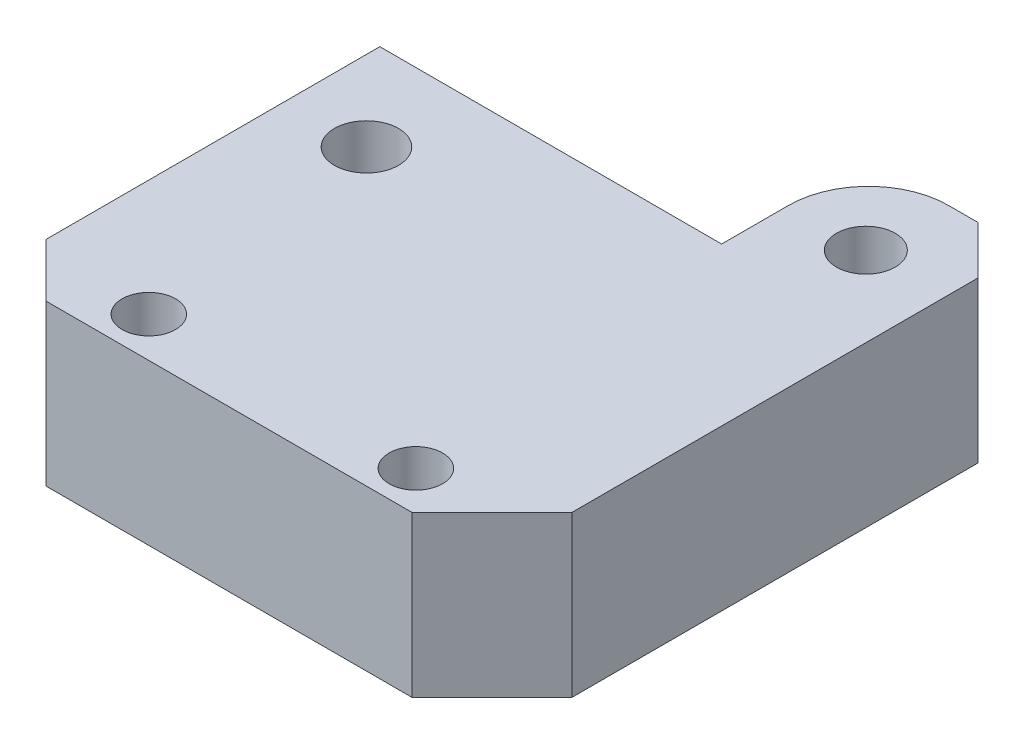
ISO-10303-21;
HEADER;
FILE_DESCRIPTION(('STEP AP214'),'2;1');
FILE_NAME('part.step','',(''),(''),'','','');
FILE_SCHEMA(('AUTOMOTIVE_DESIGN { 1 0 10303 214 1 1 1 1 }'));
ENDSEC;
DATA;
#1=APPLICATION_CONTEXT('core data for automotive mechanical design processes');
#2=APPLICATION_PROTOCOL_DEFINITION('international standard','automotive_design',2000,#1);
#3=PRODUCT_CONTEXT('',#1,'mechanical');
#4=PRODUCT('Part','Part','',(#3));
#5=PRODUCT_RELATED_PRODUCT_CATEGORY('part','',(#4));
#6=PRODUCT_DEFINITION_FORMATION('','',#4);
#7=PRODUCT_DEFINITION_CONTEXT('part definition',#1,'design');
#8=PRODUCT_DEFINITION('design','',#6,#7);
#9=PRODUCT_DEFINITION_SHAPE('','',#8);
#10=(LENGTH_UNIT() NAMED_UNIT(*) SI_UNIT(.MILLI.,.METRE.));
#11=(NAMED_UNIT(*) PLANE_ANGLE_UNIT() SI_UNIT($,.RADIAN.));
#12=(NAMED_UNIT(*) SI_UNIT($,.STERADIAN.) SOLID_ANGLE_UNIT());
#13=UNCERTAINTY_MEASURE_WITH_UNIT(LENGTH_MEASURE(1.E-05),#10,'distance_accuracy_value','');
#14=(GEOMETRIC_REPRESENTATION_CONTEXT(3) GLOBAL_UNCERTAINTY_ASSIGNED_CONTEXT((#13)) GLOBAL_UNIT_ASSIGNED_CONTEXT((#10,
#11,#12)) REPRESENTATION_CONTEXT('',''));
#15=CARTESIAN_POINT('',(0.,0.,0.));
#16=DIRECTION('',(0.,0.,1.));
#17=DIRECTION('',(1.,0.,0.));
#18=AXIS2_PLACEMENT_3D('',#15,#16,#17);
#19=CARTESIAN_POINT('',(7.67600906845509E-13,0.,120.));
#20=DIRECTION('',(-1.,0.,0.));
#21=DIRECTION('',(0.,0.,1.));
#22=AXIS2_PLACEMENT_3D('',#19,#20,#21);
#23=PLANE('',#22);
#24=DIRECTION('',(0.,0.,1.));
#25=VECTOR('',#24,1.);
#26=CARTESIAN_POINT('',(7.67600906845509E-13,0.,120.));
#27=LINE('',#26,#25);
#28=CARTESIAN_POINT('',(8.03100647713192E-13,0.,125.5));
#29=VERTEX_POINT('',#28);
#30=CARTESIAN_POINT('',(8.83781876957922E-13,0.,138.));
#31=VERTEX_POINT('',#30);
#32=EDGE_CURVE('E151',#29,#31,#27,.T.);
#33=ORIENTED_EDGE('',*,*,#32,.T.);
#34=DIRECTION('',(0.,1.,0.));
#35=VECTOR('',#34,1.);
#36=CARTESIAN_POINT('',(8.83781876957922E-13,0.,138.));
#37=LINE('',#36,#35);
#38=CARTESIAN_POINT('',(8.83781876957922E-13,6.,138.));
#39=VERTEX_POINT('',#38);
#40=EDGE_CURVE('E228',#31,#39,#37,.T.);
#41=ORIENTED_EDGE('',*,*,#40,.T.);
#42=DIRECTION('',(0.,0.,1.));
#43=VECTOR('',#42,1.);
#44=CARTESIAN_POINT('',(7.67600906845509E-13,6.,120.));
#45=LINE('',#44,#43);
#46=CARTESIAN_POINT('',(8.03100647713192E-13,6.,125.5));
#47=VERTEX_POINT('',#46);
#48=EDGE_CURVE('E176',#47,#39,#45,.T.);
#49=ORIENTED_EDGE('',*,*,#48,.F.);
#50=DIRECTION('',(0.,-0.707106781186569,-0.707106781186526));
#51=VECTOR('',#50,1.);
#52=CARTESIAN_POINT('',(7.65987282260616E-13,0.249999999999746,119.75));
#53=LINE('',#52,#51);
#54=CARTESIAN_POINT('',(8.01113333894915E-13,5.59999999999999,125.1));
#55=VERTEX_POINT('',#54);
#56=EDGE_CURVE('E191',#47,#55,#53,.T.);
#57=ORIENTED_EDGE('',*,*,#56,.T.);
#58=DIRECTION('',(0.,-1.,0.));
#59=VECTOR('',#58,1.);
#60=CARTESIAN_POINT('',(8.01113333894915E-13,6.,125.1));
#61=LINE('',#60,#59);
#62=CARTESIAN_POINT('',(8.01113333894915E-13,0.400000000000012,125.1));
#63=VERTEX_POINT('',#62);
#64=EDGE_CURVE('E179',#55,#63,#61,.T.);
#65=ORIENTED_EDGE('',*,*,#64,.T.);
#66=DIRECTION('',(0.,0.707106781186548,-0.707106781186548));
#67=VECTOR('',#66,1.);
#68=CARTESIAN_POINT('',(7.85350777279351E-13,2.75000000000009,122.75));
#69=LINE('',#68,#67);
#70=EDGE_CURVE('E194',#63,#29,#69,.F.);
#71=ORIENTED_EDGE('',*,*,#70,.T.);
#72=EDGE_LOOP('',(#33,#41,#49,#57,#65,#71));
#73=FACE_BOUND('',#72,.T.);
#74=ADVANCED_FACE('F50',(#73),#23,.T.);
#75=CARTESIAN_POINT('',(0.,0.,0.));
#76=DIRECTION('',(0.,1.,0.));
#77=DIRECTION('',(0.,0.,1.));
#78=AXIS2_PLACEMENT_3D('',#75,#76,#77);
#79=PLANE('',#78);
#80=CARTESIAN_POINT('',(15.700000000001,0.,123.));
#81=DIRECTION('',(0.,1.,0.));
#82=DIRECTION('',(0.,0.,1.));
#83=AXIS2_PLACEMENT_3D('',#80,#81,#82);
#84=CIRCLE('',#83,1.09999999999998);
#85=CARTESIAN_POINT('',(15.700000000001,0.,124.1));
#86=VERTEX_POINT('',#85);
#87=EDGE_CURVE('E362',#86,#86,#84,.T.);
#88=ORIENTED_EDGE('',*,*,#87,.T.);
#89=EDGE_LOOP('',(#88));
#90=FACE_BOUND('',#89,.T.);
#91=CARTESIAN_POINT('',(3.00000000000079,0.,129.));
#92=DIRECTION('',(0.,1.,0.));
#93=DIRECTION('',(0.,0.,1.));
#94=AXIS2_PLACEMENT_3D('',#91,#92,#93);
#95=CIRCLE('',#94,1.19999999999999);
#96=CARTESIAN_POINT('',(3.00000000000079,0.,130.2));
#97=VERTEX_POINT('',#96);
#98=EDGE_CURVE('E359',#97,#97,#95,.T.);
#99=ORIENTED_EDGE('',*,*,#98,.T.);
#100=EDGE_LOOP('',(#99));
#101=FACE_BOUND('',#100,.T.);
#102=CARTESIAN_POINT('',(14.3499999999996,0.,138.5));
#103=DIRECTION('',(0.,1.,0.));
#104=DIRECTION('',(0.,0.,1.));
#105=AXIS2_PLACEMENT_3D('',#102,#103,#104);
#106=CIRCLE('',#105,0.999999999999985);
#107=CARTESIAN_POINT('',(14.3499999999996,0.,139.5));
#108=VERTEX_POINT('',#107);
#109=EDGE_CURVE('E376',#108,#108,#106,.T.);
#110=ORIENTED_EDGE('',*,*,#109,.T.);
#111=EDGE_LOOP('',(#110));
#112=FACE_BOUND('',#111,.T.);
#113=CARTESIAN_POINT('',(4.34999999999965,0.,138.5));
#114=DIRECTION('',(0.,1.,0.));
#115=DIRECTION('',(0.,0.,1.));
#116=AXIS2_PLACEMENT_3D('',#113,#114,#115);
#117=CIRCLE('',#116,0.999999999999986);
#118=CARTESIAN_POINT('',(4.34999999999965,0.,139.5));
#119=VERTEX_POINT('',#118);
#120=EDGE_CURVE('E261',#119,#119,#117,.T.);
#121=ORIENTED_EDGE('',*,*,#120,.T.);
#122=EDGE_LOOP('',(#121));
#123=FACE_BOUND('',#122,.T.);
#124=DIRECTION('',(0.,0.,1.));
#125=VECTOR('',#124,1.);
#126=CARTESIAN_POINT('',(12.8000000000007,0.,120.));
#127=LINE('',#126,#125);
#128=CARTESIAN_POINT('',(12.8000000000006,0.,123.));
#129=VERTEX_POINT('',#128);
#130=CARTESIAN_POINT('',(12.8000000000006,0.,125.5));
#131=VERTEX_POINT('',#130);
#132=EDGE_CURVE('E251',#129,#131,#127,.T.);
#133=ORIENTED_EDGE('',*,*,#132,.F.);
#134=CARTESIAN_POINT('',(15.8000000000006,0.,123.));
#135=DIRECTION('',(0.,1.,0.));
#136=DIRECTION('',(0.,0.,1.));
#137=AXIS2_PLACEMENT_3D('',#134,#135,#136);
#138=CIRCLE('',#137,3.);
#139=CARTESIAN_POINT('',(15.8000000000006,0.,120.));
#140=VERTEX_POINT('',#139);
#141=EDGE_CURVE('E66',#129,#140,#138,.F.);
#142=ORIENTED_EDGE('',*,*,#141,.T.);
#143=DIRECTION('',(-1.,0.,0.));
#144=VECTOR('',#143,1.);
#145=CARTESIAN_POINT('',(16.9000000000007,0.,120.));
#146=LINE('',#145,#144);
#147=CARTESIAN_POINT('',(16.9000000000007,0.,120.));
#148=VERTEX_POINT('',#147);
#149=EDGE_CURVE('E138',#148,#140,#146,.T.);
#150=ORIENTED_EDGE('',*,*,#149,.F.);
#151=DIRECTION('',(-0.707106781186546,0.,-0.707106781186549));
#152=VECTOR('',#151,1.);
#153=CARTESIAN_POINT('',(18.7000000000007,0.,121.8));
#154=LINE('',#153,#152);
#155=CARTESIAN_POINT('',(18.7000000000007,0.,121.8));
#156=VERTEX_POINT('',#155);
#157=EDGE_CURVE('E149',#156,#148,#154,.T.);
#158=ORIENTED_EDGE('',*,*,#157,.F.);
#159=DIRECTION('',(0.,0.,-1.));
#160=VECTOR('',#159,1.);
#161=CARTESIAN_POINT('',(18.7000000000008,0.,140.));
#162=LINE('',#161,#160);
#163=CARTESIAN_POINT('',(18.7000000000008,0.,137.));
#164=VERTEX_POINT('',#163);
#165=EDGE_CURVE('E145',#164,#156,#162,.T.);
#166=ORIENTED_EDGE('',*,*,#165,.F.);
#167=DIRECTION('',(0.707106781186534,0.,-0.707106781186561));
#168=VECTOR('',#167,1.);
#169=CARTESIAN_POINT('',(15.7000000000009,0.,140.));
#170=LINE('',#169,#168);
#171=CARTESIAN_POINT('',(15.7000000000009,0.,140.));
#172=VERTEX_POINT('',#171);
#173=EDGE_CURVE('E227',#164,#172,#170,.F.);
#174=ORIENTED_EDGE('',*,*,#173,.T.);
#175=DIRECTION('',(1.,0.,0.));
#176=VECTOR('',#175,1.);
#177=CARTESIAN_POINT('',(8.96690873637079E-13,0.,140.));
#178=LINE('',#177,#176);
#179=CARTESIAN_POINT('',(2.00000000000087,0.,140.));
#180=VERTEX_POINT('',#179);
#181=EDGE_CURVE('E166',#180,#172,#178,.T.);
#182=ORIENTED_EDGE('',*,*,#181,.F.);
#183=DIRECTION('',(0.707106781186544,0.,0.707106781186551));
#184=VECTOR('',#183,1.);
#185=CARTESIAN_POINT('',(8.83781876957922E-13,0.,138.));
#186=LINE('',#185,#184);
#187=EDGE_CURVE('E238',#180,#31,#186,.F.);
#188=ORIENTED_EDGE('',*,*,#187,.T.);
#189=ORIENTED_EDGE('',*,*,#32,.F.);
#190=DIRECTION('',(1.,0.,0.));
#191=VECTOR('',#190,1.);
#192=CARTESIAN_POINT('',(5.44269490587734E-13,0.,125.5));
#193=LINE('',#192,#191);
#194=EDGE_CURVE('E202',#29,#131,#193,.T.);
#195=ORIENTED_EDGE('',*,*,#194,.T.);
#196=EDGE_LOOP('',(#133,#142,#150,#158,#166,#174,#182,#188,#189,#195));
#197=FACE_BOUND('',#196,.T.);
#198=ADVANCED_FACE('F150',(#90,#101,#112,#123,#197),#79,.F.);
#199=CARTESIAN_POINT('',(0.,6.,0.));
#200=DIRECTION('',(0.,1.,0.));
#201=DIRECTION('',(0.,0.,1.));
#202=AXIS2_PLACEMENT_3D('',#199,#200,#201);
#203=PLANE('',#202);
#204=CARTESIAN_POINT('',(15.700000000001,6.,123.));
#205=DIRECTION('',(0.,1.,0.));
#206=DIRECTION('',(0.,0.,1.));
#207=AXIS2_PLACEMENT_3D('',#204,#205,#206);
#208=CIRCLE('',#207,1.09999999999998);
#209=CARTESIAN_POINT('',(15.700000000001,6.,124.1));
#210=VERTEX_POINT('',#209);
#211=EDGE_CURVE('E369',#210,#210,#208,.T.);
#212=ORIENTED_EDGE('',*,*,#211,.F.);
#213=EDGE_LOOP('',(#212));
#214=FACE_BOUND('',#213,.T.);
#215=CARTESIAN_POINT('',(3.00000000000079,6.,129.));
#216=DIRECTION('',(0.,1.,0.));
#217=DIRECTION('',(0.,0.,1.));
#218=AXIS2_PLACEMENT_3D('',#215,#216,#217);
#219=CIRCLE('',#218,1.19999999999999);
#220=CARTESIAN_POINT('',(3.00000000000079,6.,130.2));
#221=VERTEX_POINT('',#220);
#222=EDGE_CURVE('E356',#221,#221,#219,.T.);
#223=ORIENTED_EDGE('',*,*,#222,.F.);
#224=EDGE_LOOP('',(#223));
#225=FACE_BOUND('',#224,.T.);
#226=CARTESIAN_POINT('',(14.3499999999996,6.,138.5));
#227=DIRECTION('',(0.,1.,0.));
#228=DIRECTION('',(0.,0.,1.));
#229=AXIS2_PLACEMENT_3D('',#226,#227,#228);
#230=CIRCLE('',#229,0.999999999999987);
#231=CARTESIAN_POINT('',(14.3499999999996,6.,139.5));
#232=VERTEX_POINT('',#231);
#233=EDGE_CURVE('E368',#232,#232,#230,.T.);
#234=ORIENTED_EDGE('',*,*,#233,.F.);
#235=EDGE_LOOP('',(#234));
#236=FACE_BOUND('',#235,.T.);
#237=CARTESIAN_POINT('',(4.34999999999965,6.,138.5));
#238=DIRECTION('',(0.,1.,0.));
#239=DIRECTION('',(0.,0.,1.));
#240=AXIS2_PLACEMENT_3D('',#237,#238,#239);
#241=CIRCLE('',#240,0.999999999999987);
#242=CARTESIAN_POINT('',(4.34999999999965,6.,139.5));
#243=VERTEX_POINT('',#242);
#244=EDGE_CURVE('E270',#243,#243,#241,.T.);
#245=ORIENTED_EDGE('',*,*,#244,.F.);
#246=EDGE_LOOP('',(#245));
#247=FACE_BOUND('',#246,.T.);
#248=DIRECTION('',(-1.,0.,0.));
#249=VECTOR('',#248,1.);
#250=CARTESIAN_POINT('',(16.9000000000007,6.,120.));
#251=LINE('',#250,#249);
#252=CARTESIAN_POINT('',(16.9000000000007,6.,120.));
#253=VERTEX_POINT('',#252);
#254=CARTESIAN_POINT('',(15.8000000000006,6.,120.));
#255=VERTEX_POINT('',#254);
#256=EDGE_CURVE('E139',#253,#255,#251,.T.);
#257=ORIENTED_EDGE('',*,*,#256,.T.);
#258=CARTESIAN_POINT('',(15.8000000000006,6.,123.));
#259=DIRECTION('',(0.,1.,0.));
#260=DIRECTION('',(0.,0.,1.));
#261=AXIS2_PLACEMENT_3D('',#258,#259,#260);
#262=CIRCLE('',#261,3.);
#263=CARTESIAN_POINT('',(12.8000000000006,6.,123.));
#264=VERTEX_POINT('',#263);
#265=EDGE_CURVE('E11',#255,#264,#262,.T.);
#266=ORIENTED_EDGE('',*,*,#265,.T.);
#267=DIRECTION('',(0.,0.,1.));
#268=VECTOR('',#267,1.);
#269=CARTESIAN_POINT('',(12.8000000000007,6.,120.));
#270=LINE('',#269,#268);
#271=CARTESIAN_POINT('',(12.8000000000006,6.,125.5));
#272=VERTEX_POINT('',#271);
#273=EDGE_CURVE('E255',#264,#272,#270,.T.);
#274=ORIENTED_EDGE('',*,*,#273,.T.);
#275=DIRECTION('',(-1.,0.,0.));
#276=VECTOR('',#275,1.);
#277=CARTESIAN_POINT('',(8.02848057370892E-13,6.,125.5));
#278=LINE('',#277,#276);
#279=EDGE_CURVE('E189',#272,#47,#278,.T.);
#280=ORIENTED_EDGE('',*,*,#279,.T.);
#281=ORIENTED_EDGE('',*,*,#48,.T.);
#282=DIRECTION('',(-0.707106781186544,0.,-0.707106781186551));
#283=VECTOR('',#282,1.);
#284=CARTESIAN_POINT('',(-68.9999999999996,6.,68.999999999999));
#285=LINE('',#284,#283);
#286=CARTESIAN_POINT('',(2.00000000000087,6.,140.));
#287=VERTEX_POINT('',#286);
#288=EDGE_CURVE('E235',#39,#287,#285,.F.);
#289=ORIENTED_EDGE('',*,*,#288,.T.);
#290=DIRECTION('',(1.,0.,0.));
#291=VECTOR('',#290,1.);
#292=CARTESIAN_POINT('',(8.96690873637079E-13,6.,140.));
#293=LINE('',#292,#291);
#294=CARTESIAN_POINT('',(15.7000000000009,6.,140.));
#295=VERTEX_POINT('',#294);
#296=EDGE_CURVE('E159',#287,#295,#293,.T.);
#297=ORIENTED_EDGE('',*,*,#296,.T.);
#298=DIRECTION('',(-0.707106781186534,0.,0.707106781186561));
#299=VECTOR('',#298,1.);
#300=CARTESIAN_POINT('',(77.8500000000006,6.,77.8499999999977));
#301=LINE('',#300,#299);
#302=CARTESIAN_POINT('',(18.7000000000008,6.,137.));
#303=VERTEX_POINT('',#302);
#304=EDGE_CURVE('E219',#295,#303,#301,.F.);
#305=ORIENTED_EDGE('',*,*,#304,.T.);
#306=DIRECTION('',(0.,0.,-1.));
#307=VECTOR('',#306,1.);
#308=CARTESIAN_POINT('',(18.7000000000008,6.,140.));
#309=LINE('',#308,#307);
#310=CARTESIAN_POINT('',(18.7000000000007,6.,121.8));
#311=VERTEX_POINT('',#310);
#312=EDGE_CURVE('E160',#303,#311,#309,.T.);
#313=ORIENTED_EDGE('',*,*,#312,.T.);
#314=DIRECTION('',(-0.707106781186546,0.,-0.707106781186549));
#315=VECTOR('',#314,1.);
#316=CARTESIAN_POINT('',(18.7000000000007,6.,121.8));
#317=LINE('',#316,#315);
#318=EDGE_CURVE('E171',#311,#253,#317,.T.);
#319=ORIENTED_EDGE('',*,*,#318,.T.);
#320=EDGE_LOOP('',(#257,#266,#274,#280,#281,#289,#297,#305,#313,#319));
#321=FACE_BOUND('',#320,.T.);
#322=ADVANCED_FACE('F292',(#214,#225,#236,#247,#321),#203,.T.);
#323=CARTESIAN_POINT('',(18.7000000000007,0.,121.8));
#324=DIRECTION('',(0.707106781186549,0.,-0.707106781186546));
#325=DIRECTION('',(-0.707106781186546,0.,-0.707106781186549));
#326=AXIS2_PLACEMENT_3D('',#323,#324,#325);
#327=PLANE('',#326);
#328=ORIENTED_EDGE('',*,*,#318,.F.);
#329=DIRECTION('',(0.,1.,0.));
#330=VECTOR('',#329,1.);
#331=CARTESIAN_POINT('',(18.7000000000007,0.,121.8));
#332=LINE('',#331,#330);
#333=EDGE_CURVE('E141',#156,#311,#332,.T.);
#334=ORIENTED_EDGE('',*,*,#333,.F.);
#335=ORIENTED_EDGE('',*,*,#157,.T.);
#336=DIRECTION('',(0.,1.,0.));
#337=VECTOR('',#336,1.);
#338=CARTESIAN_POINT('',(16.9000000000007,0.,120.));
#339=LINE('',#338,#337);
#340=EDGE_CURVE('E131',#148,#253,#339,.T.);
#341=ORIENTED_EDGE('',*,*,#340,.T.);
#342=EDGE_LOOP('',(#328,#334,#335,#341));
#343=FACE_BOUND('',#342,.T.);
#344=ADVANCED_FACE('F152',(#343),#327,.T.);
#345=CARTESIAN_POINT('',(18.7000000000008,0.,140.));
#346=DIRECTION('',(1.,0.,0.));
#347=DIRECTION('',(0.,0.,-1.));
#348=AXIS2_PLACEMENT_3D('',#345,#346,#347);
#349=PLANE('',#348);
#350=ORIENTED_EDGE('',*,*,#312,.F.);
#351=DIRECTION('',(0.,-1.,0.));
#352=VECTOR('',#351,1.);
#353=CARTESIAN_POINT('',(18.7000000000008,0.,137.));
#354=LINE('',#353,#352);
#355=EDGE_CURVE('E224',#303,#164,#354,.T.);
#356=ORIENTED_EDGE('',*,*,#355,.T.);
#357=ORIENTED_EDGE('',*,*,#165,.T.);
#358=ORIENTED_EDGE('',*,*,#333,.T.);
#359=EDGE_LOOP('',(#350,#356,#357,#358));
#360=FACE_BOUND('',#359,.T.);
#361=ADVANCED_FACE('F326',(#360),#349,.T.);
#362=CARTESIAN_POINT('',(8.96690873637079E-13,0.,140.));
#363=DIRECTION('',(0.,0.,1.));
#364=DIRECTION('',(1.,0.,0.));
#365=AXIS2_PLACEMENT_3D('',#362,#363,#364);
#366=PLANE('',#365);
#367=ORIENTED_EDGE('',*,*,#296,.F.);
#368=DIRECTION('',(0.,-1.,0.));
#369=VECTOR('',#368,1.);
#370=CARTESIAN_POINT('',(2.00000000000087,0.,140.));
#371=LINE('',#370,#369);
#372=EDGE_CURVE('E240',#287,#180,#371,.T.);
#373=ORIENTED_EDGE('',*,*,#372,.T.);
#374=ORIENTED_EDGE('',*,*,#181,.T.);
#375=DIRECTION('',(0.,1.,0.));
#376=VECTOR('',#375,1.);
#377=CARTESIAN_POINT('',(15.7000000000009,0.,140.));
#378=LINE('',#377,#376);
#379=EDGE_CURVE('E216',#172,#295,#378,.T.);
#380=ORIENTED_EDGE('',*,*,#379,.T.);
#381=EDGE_LOOP('',(#367,#373,#374,#380));
#382=FACE_BOUND('',#381,.T.);
#383=ADVANCED_FACE('F325',(#382),#366,.T.);
#384=CARTESIAN_POINT('',(16.9000000000007,0.,120.));
#385=DIRECTION('',(0.,0.,-1.));
#386=DIRECTION('',(-1.,0.,0.));
#387=AXIS2_PLACEMENT_3D('',#384,#385,#386);
#388=PLANE('',#387);
#389=ORIENTED_EDGE('',*,*,#149,.T.);
#390=DIRECTION('',(0.,-1.,0.));
#391=VECTOR('',#390,1.);
#392=CARTESIAN_POINT('',(15.8000000000006,6.,120.));
#393=LINE('',#392,#391);
#394=EDGE_CURVE('E57',#140,#255,#393,.F.);
#395=ORIENTED_EDGE('',*,*,#394,.T.);
#396=ORIENTED_EDGE('',*,*,#256,.F.);
#397=ORIENTED_EDGE('',*,*,#340,.F.);
#398=EDGE_LOOP('',(#389,#395,#396,#397));
#399=FACE_BOUND('',#398,.T.);
#400=ADVANCED_FACE('F133',(#399),#388,.T.);
#401=CARTESIAN_POINT('',(12.8000000000006,6.,125.1));
#402=DIRECTION('',(0.,0.,1.));
#403=DIRECTION('',(1.,0.,0.));
#404=AXIS2_PLACEMENT_3D('',#401,#402,#403);
#405=PLANE('',#404);
#406=ORIENTED_EDGE('',*,*,#64,.F.);
#407=DIRECTION('',(1.,0.,0.));
#408=VECTOR('',#407,1.);
#409=CARTESIAN_POINT('',(12.8000000000006,5.59999999999999,125.1));
#410=LINE('',#409,#408);
#411=CARTESIAN_POINT('',(12.8000000000006,5.59999999999999,125.1));
#412=VERTEX_POINT('',#411);
#413=EDGE_CURVE('E205',#55,#412,#410,.T.);
#414=ORIENTED_EDGE('',*,*,#413,.T.);
#415=DIRECTION('',(0.,-1.,0.));
#416=VECTOR('',#415,1.);
#417=CARTESIAN_POINT('',(12.8000000000006,6.,125.1));
#418=LINE('',#417,#416);
#419=CARTESIAN_POINT('',(12.8000000000006,0.400000000000012,125.1));
#420=VERTEX_POINT('',#419);
#421=EDGE_CURVE('E162',#412,#420,#418,.T.);
#422=ORIENTED_EDGE('',*,*,#421,.T.);
#423=DIRECTION('',(-1.,0.,0.));
#424=VECTOR('',#423,1.);
#425=CARTESIAN_POINT('',(12.8000000000006,0.400000000000012,125.1));
#426=LINE('',#425,#424);
#427=EDGE_CURVE('E196',#420,#63,#426,.T.);
#428=ORIENTED_EDGE('',*,*,#427,.T.);
#429=EDGE_LOOP('',(#406,#414,#422,#428));
#430=FACE_BOUND('',#429,.T.);
#431=ADVANCED_FACE('F279',(#430),#405,.F.);
#432=CARTESIAN_POINT('',(12.8000000000007,6.,120.));
#433=DIRECTION('',(1.,0.,0.));
#434=DIRECTION('',(0.,0.,-1.));
#435=AXIS2_PLACEMENT_3D('',#432,#433,#434);
#436=PLANE('',#435);
#437=ORIENTED_EDGE('',*,*,#273,.F.);
#438=DIRECTION('',(0.,-1.,0.));
#439=VECTOR('',#438,1.);
#440=CARTESIAN_POINT('',(12.8000000000006,0.,123.));
#441=LINE('',#440,#439);
#442=EDGE_CURVE('E245',#264,#129,#441,.T.);
#443=ORIENTED_EDGE('',*,*,#442,.T.);
#444=ORIENTED_EDGE('',*,*,#132,.T.);
#445=DIRECTION('',(0.,-0.707106781186548,0.707106781186548));
#446=VECTOR('',#445,1.);
#447=CARTESIAN_POINT('',(12.8000000000007,5.75000000000002,119.75));
#448=LINE('',#447,#446);
#449=EDGE_CURVE('E213',#131,#420,#448,.F.);
#450=ORIENTED_EDGE('',*,*,#449,.T.);
#451=ORIENTED_EDGE('',*,*,#421,.F.);
#452=DIRECTION('',(0.,0.707106781186569,0.707106781186526));
#453=VECTOR('',#452,1.);
#454=CARTESIAN_POINT('',(12.8000000000006,3.24999999999999,122.75));
#455=LINE('',#454,#453);
#456=EDGE_CURVE('E207',#412,#272,#455,.T.);
#457=ORIENTED_EDGE('',*,*,#456,.T.);
#458=EDGE_LOOP('',(#437,#443,#444,#450,#451,#457));
#459=FACE_BOUND('',#458,.T.);
#460=ADVANCED_FACE('F252',(#459),#436,.F.);
#461=CARTESIAN_POINT('',(4.34999999999965,6.,138.5));
#462=DIRECTION('',(0.,1.,0.));
#463=DIRECTION('',(0.,0.,1.));
#464=AXIS2_PLACEMENT_3D('',#461,#462,#463);
#465=CYLINDRICAL_SURFACE('',#464,0.999999999999987);
#466=ORIENTED_EDGE('',*,*,#120,.F.);
#467=EDGE_LOOP('',(#466));
#468=FACE_BOUND('',#467,.T.);
#469=ORIENTED_EDGE('',*,*,#244,.T.);
#470=EDGE_LOOP('',(#469));
#471=FACE_BOUND('',#470,.T.);
#472=ADVANCED_FACE('F344',(#468,#471),#465,.F.);
#473=CARTESIAN_POINT('',(14.3499999999996,6.,138.5));
#474=DIRECTION('',(0.,1.,0.));
#475=DIRECTION('',(0.,0.,1.));
#476=AXIS2_PLACEMENT_3D('',#473,#474,#475);
#477=CYLINDRICAL_SURFACE('',#476,0.999999999999986);
#478=ORIENTED_EDGE('',*,*,#109,.F.);
#479=EDGE_LOOP('',(#478));
#480=FACE_BOUND('',#479,.T.);
#481=ORIENTED_EDGE('',*,*,#233,.T.);
#482=EDGE_LOOP('',(#481));
#483=FACE_BOUND('',#482,.T.);
#484=ADVANCED_FACE('F341',(#480,#483),#477,.F.);
#485=CARTESIAN_POINT('',(3.00000000000079,6.,129.));
#486=DIRECTION('',(0.,1.,0.));
#487=DIRECTION('',(0.,0.,1.));
#488=AXIS2_PLACEMENT_3D('',#485,#486,#487);
#489=CYLINDRICAL_SURFACE('',#488,1.19999999999999);
#490=ORIENTED_EDGE('',*,*,#98,.F.);
#491=EDGE_LOOP('',(#490));
#492=FACE_BOUND('',#491,.T.);
#493=ORIENTED_EDGE('',*,*,#222,.T.);
#494=EDGE_LOOP('',(#493));
#495=FACE_BOUND('',#494,.T.);
#496=ADVANCED_FACE('F308',(#492,#495),#489,.F.);
#497=CARTESIAN_POINT('',(15.700000000001,6.,123.));
#498=DIRECTION('',(0.,1.,0.));
#499=DIRECTION('',(0.,0.,1.));
#500=AXIS2_PLACEMENT_3D('',#497,#498,#499);
#501=CYLINDRICAL_SURFACE('',#500,1.09999999999998);
#502=ORIENTED_EDGE('',*,*,#87,.F.);
#503=EDGE_LOOP('',(#502));
#504=FACE_BOUND('',#503,.T.);
#505=ORIENTED_EDGE('',*,*,#211,.T.);
#506=EDGE_LOOP('',(#505));
#507=FACE_BOUND('',#506,.T.);
#508=ADVANCED_FACE('F299',(#504,#507),#501,.F.);
#509=CARTESIAN_POINT('',(5.44269490587733E-13,6.,125.5));
#510=DIRECTION('',(0.,0.707106781186526,-0.707106781186569));
#511=DIRECTION('',(1.,0.,0.));
#512=AXIS2_PLACEMENT_3D('',#509,#510,#511);
#513=PLANE('',#512);
#514=ORIENTED_EDGE('',*,*,#456,.F.);
#515=ORIENTED_EDGE('',*,*,#413,.F.);
#516=ORIENTED_EDGE('',*,*,#56,.F.);
#517=ORIENTED_EDGE('',*,*,#279,.F.);
#518=EDGE_LOOP('',(#514,#515,#516,#517));
#519=FACE_BOUND('',#518,.T.);
#520=ADVANCED_FACE('F293',(#519),#513,.T.);
#521=CARTESIAN_POINT('',(12.8000000000006,0.400000000000012,125.1));
#522=DIRECTION('',(0.,0.707106781186548,0.707106781186548));
#523=DIRECTION('',(-1.,0.,0.));
#524=AXIS2_PLACEMENT_3D('',#521,#522,#523);
#525=PLANE('',#524);
#526=ORIENTED_EDGE('',*,*,#449,.F.);
#527=ORIENTED_EDGE('',*,*,#194,.F.);
#528=ORIENTED_EDGE('',*,*,#70,.F.);
#529=ORIENTED_EDGE('',*,*,#427,.F.);
#530=EDGE_LOOP('',(#526,#527,#528,#529));
#531=FACE_BOUND('',#530,.T.);
#532=ADVANCED_FACE('F284',(#531),#525,.F.);
#533=CARTESIAN_POINT('',(15.7000000000009,0.,140.));
#534=DIRECTION('',(-0.707106781186561,0.,-0.707106781186534));
#535=DIRECTION('',(0.,1.,0.));
#536=AXIS2_PLACEMENT_3D('',#533,#534,#535);
#537=PLANE('',#536);
#538=ORIENTED_EDGE('',*,*,#173,.F.);
#539=ORIENTED_EDGE('',*,*,#355,.F.);
#540=ORIENTED_EDGE('',*,*,#304,.F.);
#541=ORIENTED_EDGE('',*,*,#379,.F.);
#542=EDGE_LOOP('',(#538,#539,#540,#541));
#543=FACE_BOUND('',#542,.T.);
#544=ADVANCED_FACE('F302',(#543),#537,.F.);
#545=CARTESIAN_POINT('',(8.83781876957922E-13,0.,138.));
#546=DIRECTION('',(0.707106781186551,0.,-0.707106781186544));
#547=DIRECTION('',(0.,1.,0.));
#548=AXIS2_PLACEMENT_3D('',#545,#546,#547);
#549=PLANE('',#548);
#550=ORIENTED_EDGE('',*,*,#187,.F.);
#551=ORIENTED_EDGE('',*,*,#372,.F.);
#552=ORIENTED_EDGE('',*,*,#288,.F.);
#553=ORIENTED_EDGE('',*,*,#40,.F.);
#554=EDGE_LOOP('',(#550,#551,#552,#553));
#555=FACE_BOUND('',#554,.T.);
#556=ADVANCED_FACE('F287',(#555),#549,.F.);
#557=CARTESIAN_POINT('',(15.8000000000006,6.,123.));
#558=DIRECTION('',(0.,1.,0.));
#559=DIRECTION('',(0.,0.,1.));
#560=AXIS2_PLACEMENT_3D('',#557,#558,#559);
#561=CYLINDRICAL_SURFACE('',#560,3.);
#562=ORIENTED_EDGE('',*,*,#265,.F.);
#563=ORIENTED_EDGE('',*,*,#394,.F.);
#564=ORIENTED_EDGE('',*,*,#141,.F.);
#565=ORIENTED_EDGE('',*,*,#442,.F.);
#566=EDGE_LOOP('',(#562,#563,#564,#565));
#567=FACE_BOUND('',#566,.T.);
#568=ADVANCED_FACE('F47',(#567),#561,.T.);
#569=CLOSED_SHELL('',(#74,#198,#322,#344,#361,#383,#400,#431,#460,#472,#484,#496,#508,#520,#532,
#544,#556,#568));
#570=MANIFOLD_SOLID_BREP('B2',#569);
#571=ADVANCED_BREP_SHAPE_REPRESENTATION('',(#18,#570),#14);
#572=SHAPE_DEFINITION_REPRESENTATION(#9,#571);
ENDSEC;
END-ISO-10303-21;
